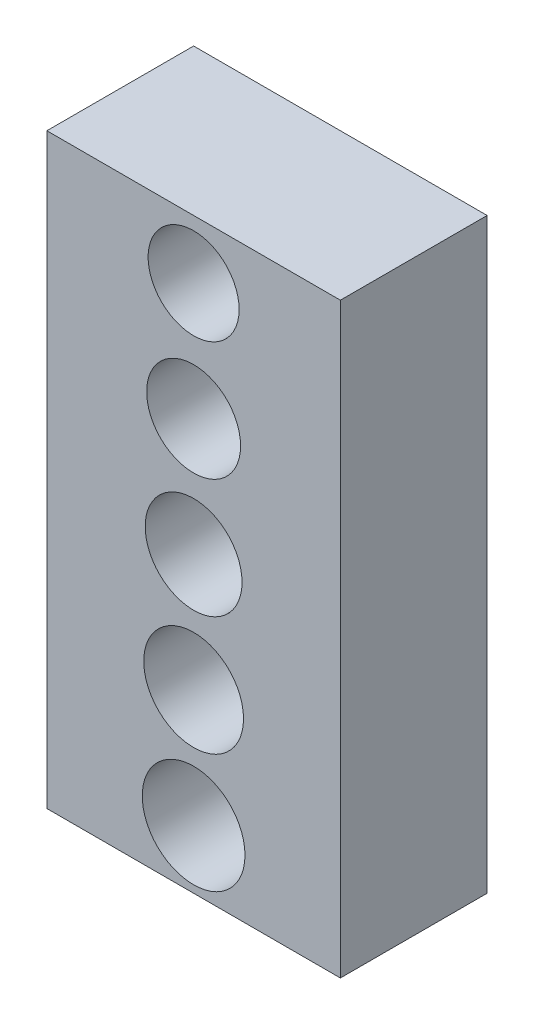
ISO-10303-21;
HEADER;
FILE_DESCRIPTION(('STEP AP214'),'2;1');
FILE_NAME('part.step','',(''),(''),'','','');
FILE_SCHEMA(('AUTOMOTIVE_DESIGN { 1 0 10303 214 1 1 1 1 }'));
ENDSEC;
DATA;
#1=APPLICATION_CONTEXT('core data for automotive mechanical design processes');
#2=APPLICATION_PROTOCOL_DEFINITION('international standard','automotive_design',2000,#1);
#3=PRODUCT_CONTEXT('',#1,'mechanical');
#4=PRODUCT('Part','Part','',(#3));
#5=PRODUCT_RELATED_PRODUCT_CATEGORY('part','',(#4));
#6=PRODUCT_DEFINITION_FORMATION('','',#4);
#7=PRODUCT_DEFINITION_CONTEXT('part definition',#1,'design');
#8=PRODUCT_DEFINITION('design','',#6,#7);
#9=PRODUCT_DEFINITION_SHAPE('','',#8);
#10=(LENGTH_UNIT() NAMED_UNIT(*) SI_UNIT(.MILLI.,.METRE.));
#11=(NAMED_UNIT(*) PLANE_ANGLE_UNIT() SI_UNIT($,.RADIAN.));
#12=(NAMED_UNIT(*) SI_UNIT($,.STERADIAN.) SOLID_ANGLE_UNIT());
#13=UNCERTAINTY_MEASURE_WITH_UNIT(LENGTH_MEASURE(1.E-05),#10,'distance_accuracy_value','');
#14=(GEOMETRIC_REPRESENTATION_CONTEXT(3) GLOBAL_UNCERTAINTY_ASSIGNED_CONTEXT((#13)) GLOBAL_UNIT_ASSIGNED_CONTEXT((#10,
#11,#12)) REPRESENTATION_CONTEXT('',''));
#15=CARTESIAN_POINT('',(0.,0.,0.));
#16=DIRECTION('',(0.,0.,1.));
#17=DIRECTION('',(1.,0.,0.));
#18=AXIS2_PLACEMENT_3D('',#15,#16,#17);
#19=CARTESIAN_POINT('',(0.,0.,5.));
#20=DIRECTION('',(0.,0.,-1.));
#21=DIRECTION('',(-1.,0.,0.));
#22=AXIS2_PLACEMENT_3D('',#19,#20,#21);
#23=PLANE('',#22);
#24=DIRECTION('',(0.,-1.,0.));
#25=VECTOR('',#24,1.);
#26=CARTESIAN_POINT('',(-5.,10.,5.));
#27=LINE('',#26,#25);
#28=CARTESIAN_POINT('',(-5.,10.,5.));
#29=VERTEX_POINT('',#28);
#30=CARTESIAN_POINT('',(-5.,-10.,5.));
#31=VERTEX_POINT('',#30);
#32=EDGE_CURVE('E85',#29,#31,#27,.T.);
#33=ORIENTED_EDGE('',*,*,#32,.T.);
#34=DIRECTION('',(1.,0.,0.));
#35=VECTOR('',#34,1.);
#36=CARTESIAN_POINT('',(5.,-10.,5.));
#37=LINE('',#36,#35);
#38=CARTESIAN_POINT('',(5.,-10.,5.));
#39=VERTEX_POINT('',#38);
#40=EDGE_CURVE('E80',#31,#39,#37,.T.);
#41=ORIENTED_EDGE('',*,*,#40,.T.);
#42=DIRECTION('',(0.,1.,0.));
#43=VECTOR('',#42,1.);
#44=CARTESIAN_POINT('',(5.,10.,5.));
#45=LINE('',#44,#43);
#46=CARTESIAN_POINT('',(5.,10.,5.));
#47=VERTEX_POINT('',#46);
#48=EDGE_CURVE('E83',#39,#47,#45,.T.);
#49=ORIENTED_EDGE('',*,*,#48,.T.);
#50=DIRECTION('',(-1.,0.,0.));
#51=VECTOR('',#50,1.);
#52=CARTESIAN_POINT('',(5.,10.,5.));
#53=LINE('',#52,#51);
#54=EDGE_CURVE('E50',#47,#29,#53,.T.);
#55=ORIENTED_EDGE('',*,*,#54,.T.);
#56=EDGE_LOOP('',(#33,#41,#49,#55));
#57=FACE_BOUND('',#56,.T.);
#58=CARTESIAN_POINT('',(0.,8.,5.));
#59=DIRECTION('',(0.,0.,1.));
#60=DIRECTION('',(1.,0.,0.));
#61=AXIS2_PLACEMENT_3D('',#58,#59,#60);
#62=CIRCLE('',#61,1.55);
#63=CARTESIAN_POINT('',(1.55,8.,5.));
#64=VERTEX_POINT('',#63);
#65=EDGE_CURVE('E100',#64,#64,#62,.T.);
#66=ORIENTED_EDGE('',*,*,#65,.F.);
#67=EDGE_LOOP('',(#66));
#68=FACE_BOUND('',#67,.T.);
#69=CARTESIAN_POINT('',(0.,-8.,5.));
#70=DIRECTION('',(0.,0.,1.));
#71=DIRECTION('',(1.,0.,0.));
#72=AXIS2_PLACEMENT_3D('',#69,#70,#71);
#73=CIRCLE('',#72,1.75);
#74=CARTESIAN_POINT('',(1.75,-8.,5.));
#75=VERTEX_POINT('',#74);
#76=EDGE_CURVE('E115',#75,#75,#73,.T.);
#77=ORIENTED_EDGE('',*,*,#76,.F.);
#78=EDGE_LOOP('',(#77));
#79=FACE_BOUND('',#78,.T.);
#80=CARTESIAN_POINT('',(0.,0.,5.));
#81=DIRECTION('',(0.,0.,1.));
#82=DIRECTION('',(1.,0.,0.));
#83=AXIS2_PLACEMENT_3D('',#80,#81,#82);
#84=CIRCLE('',#83,1.65);
#85=CARTESIAN_POINT('',(1.65,0.,5.));
#86=VERTEX_POINT('',#85);
#87=EDGE_CURVE('E121',#86,#86,#84,.T.);
#88=ORIENTED_EDGE('',*,*,#87,.F.);
#89=EDGE_LOOP('',(#88));
#90=FACE_BOUND('',#89,.T.);
#91=CARTESIAN_POINT('',(0.,-4.,5.));
#92=DIRECTION('',(0.,0.,1.));
#93=DIRECTION('',(1.,0.,0.));
#94=AXIS2_PLACEMENT_3D('',#91,#92,#93);
#95=CIRCLE('',#94,1.7);
#96=CARTESIAN_POINT('',(1.7,-4.,5.));
#97=VERTEX_POINT('',#96);
#98=EDGE_CURVE('E127',#97,#97,#95,.T.);
#99=ORIENTED_EDGE('',*,*,#98,.F.);
#100=EDGE_LOOP('',(#99));
#101=FACE_BOUND('',#100,.T.);
#102=CARTESIAN_POINT('',(0.,4.,5.));
#103=DIRECTION('',(0.,0.,1.));
#104=DIRECTION('',(1.,0.,0.));
#105=AXIS2_PLACEMENT_3D('',#102,#103,#104);
#106=CIRCLE('',#105,1.6);
#107=CARTESIAN_POINT('',(1.6,4.,5.));
#108=VERTEX_POINT('',#107);
#109=EDGE_CURVE('E133',#108,#108,#106,.T.);
#110=ORIENTED_EDGE('',*,*,#109,.F.);
#111=EDGE_LOOP('',(#110));
#112=FACE_BOUND('',#111,.T.);
#113=ADVANCED_FACE('F33',(#57,#68,#79,#90,#101,#112),#23,.F.);
#114=CARTESIAN_POINT('',(0.,0.,0.));
#115=DIRECTION('',(0.,0.,-1.));
#116=DIRECTION('',(-1.,0.,0.));
#117=AXIS2_PLACEMENT_3D('',#114,#115,#116);
#118=PLANE('',#117);
#119=CARTESIAN_POINT('',(0.,-4.,0.));
#120=DIRECTION('',(0.,0.,1.));
#121=DIRECTION('',(1.,0.,0.));
#122=AXIS2_PLACEMENT_3D('',#119,#120,#121);
#123=CIRCLE('',#122,1.7);
#124=CARTESIAN_POINT('',(1.7,-4.,0.));
#125=VERTEX_POINT('',#124);
#126=EDGE_CURVE('E130',#125,#125,#123,.T.);
#127=ORIENTED_EDGE('',*,*,#126,.T.);
#128=EDGE_LOOP('',(#127));
#129=FACE_BOUND('',#128,.T.);
#130=CARTESIAN_POINT('',(0.,-8.,0.));
#131=DIRECTION('',(0.,0.,1.));
#132=DIRECTION('',(1.,0.,0.));
#133=AXIS2_PLACEMENT_3D('',#130,#131,#132);
#134=CIRCLE('',#133,1.75);
#135=CARTESIAN_POINT('',(1.75,-8.,0.));
#136=VERTEX_POINT('',#135);
#137=EDGE_CURVE('E118',#136,#136,#134,.T.);
#138=ORIENTED_EDGE('',*,*,#137,.T.);
#139=EDGE_LOOP('',(#138));
#140=FACE_BOUND('',#139,.T.);
#141=DIRECTION('',(0.,-1.,0.));
#142=VECTOR('',#141,1.);
#143=CARTESIAN_POINT('',(-5.,10.,0.));
#144=LINE('',#143,#142);
#145=CARTESIAN_POINT('',(-5.,10.,0.));
#146=VERTEX_POINT('',#145);
#147=CARTESIAN_POINT('',(-5.,-10.,0.));
#148=VERTEX_POINT('',#147);
#149=EDGE_CURVE('E97',#146,#148,#144,.T.);
#150=ORIENTED_EDGE('',*,*,#149,.F.);
#151=DIRECTION('',(-1.,0.,0.));
#152=VECTOR('',#151,1.);
#153=CARTESIAN_POINT('',(5.,10.,0.));
#154=LINE('',#153,#152);
#155=CARTESIAN_POINT('',(5.,10.,0.));
#156=VERTEX_POINT('',#155);
#157=EDGE_CURVE('E73',#156,#146,#154,.T.);
#158=ORIENTED_EDGE('',*,*,#157,.F.);
#159=DIRECTION('',(0.,1.,0.));
#160=VECTOR('',#159,1.);
#161=CARTESIAN_POINT('',(5.,10.,0.));
#162=LINE('',#161,#160);
#163=CARTESIAN_POINT('',(5.,-10.,0.));
#164=VERTEX_POINT('',#163);
#165=EDGE_CURVE('E67',#164,#156,#162,.T.);
#166=ORIENTED_EDGE('',*,*,#165,.F.);
#167=DIRECTION('',(1.,0.,0.));
#168=VECTOR('',#167,1.);
#169=CARTESIAN_POINT('',(5.,-10.,0.));
#170=LINE('',#169,#168);
#171=EDGE_CURVE('E89',#148,#164,#170,.T.);
#172=ORIENTED_EDGE('',*,*,#171,.F.);
#173=EDGE_LOOP('',(#150,#158,#166,#172));
#174=FACE_BOUND('',#173,.T.);
#175=CARTESIAN_POINT('',(0.,8.,0.));
#176=DIRECTION('',(0.,0.,1.));
#177=DIRECTION('',(1.,0.,0.));
#178=AXIS2_PLACEMENT_3D('',#175,#176,#177);
#179=CIRCLE('',#178,1.55);
#180=CARTESIAN_POINT('',(1.55,8.,0.));
#181=VERTEX_POINT('',#180);
#182=EDGE_CURVE('E112',#181,#181,#179,.T.);
#183=ORIENTED_EDGE('',*,*,#182,.T.);
#184=EDGE_LOOP('',(#183));
#185=FACE_BOUND('',#184,.T.);
#186=CARTESIAN_POINT('',(0.,0.,0.));
#187=DIRECTION('',(0.,0.,1.));
#188=DIRECTION('',(1.,0.,0.));
#189=AXIS2_PLACEMENT_3D('',#186,#187,#188);
#190=CIRCLE('',#189,1.65);
#191=CARTESIAN_POINT('',(1.65,0.,0.));
#192=VERTEX_POINT('',#191);
#193=EDGE_CURVE('E124',#192,#192,#190,.T.);
#194=ORIENTED_EDGE('',*,*,#193,.T.);
#195=EDGE_LOOP('',(#194));
#196=FACE_BOUND('',#195,.T.);
#197=CARTESIAN_POINT('',(0.,4.,0.));
#198=DIRECTION('',(0.,0.,1.));
#199=DIRECTION('',(1.,0.,0.));
#200=AXIS2_PLACEMENT_3D('',#197,#198,#199);
#201=CIRCLE('',#200,1.6);
#202=CARTESIAN_POINT('',(1.6,4.,0.));
#203=VERTEX_POINT('',#202);
#204=EDGE_CURVE('E136',#203,#203,#201,.T.);
#205=ORIENTED_EDGE('',*,*,#204,.T.);
#206=EDGE_LOOP('',(#205));
#207=FACE_BOUND('',#206,.T.);
#208=ADVANCED_FACE('F108',(#129,#140,#174,#185,#196,#207),#118,.T.);
#209=CARTESIAN_POINT('',(-5.,10.,5.));
#210=DIRECTION('',(1.,0.,0.));
#211=DIRECTION('',(0.,1.,0.));
#212=AXIS2_PLACEMENT_3D('',#209,#210,#211);
#213=PLANE('',#212);
#214=ORIENTED_EDGE('',*,*,#149,.T.);
#215=DIRECTION('',(0.,0.,-1.));
#216=VECTOR('',#215,1.);
#217=CARTESIAN_POINT('',(-5.,-10.,5.));
#218=LINE('',#217,#216);
#219=EDGE_CURVE('E11',#31,#148,#218,.T.);
#220=ORIENTED_EDGE('',*,*,#219,.F.);
#221=ORIENTED_EDGE('',*,*,#32,.F.);
#222=DIRECTION('',(0.,0.,-1.));
#223=VECTOR('',#222,1.);
#224=CARTESIAN_POINT('',(-5.,10.,5.));
#225=LINE('',#224,#223);
#226=EDGE_CURVE('E93',#29,#146,#225,.T.);
#227=ORIENTED_EDGE('',*,*,#226,.T.);
#228=EDGE_LOOP('',(#214,#220,#221,#227));
#229=FACE_BOUND('',#228,.T.);
#230=ADVANCED_FACE('F35',(#229),#213,.F.);
#231=CARTESIAN_POINT('',(5.,-10.,5.));
#232=DIRECTION('',(0.,1.,0.));
#233=DIRECTION('',(-1.,0.,0.));
#234=AXIS2_PLACEMENT_3D('',#231,#232,#233);
#235=PLANE('',#234);
#236=ORIENTED_EDGE('',*,*,#171,.T.);
#237=DIRECTION('',(0.,0.,-1.));
#238=VECTOR('',#237,1.);
#239=CARTESIAN_POINT('',(5.,-10.,5.));
#240=LINE('',#239,#238);
#241=EDGE_CURVE('E42',#39,#164,#240,.T.);
#242=ORIENTED_EDGE('',*,*,#241,.F.);
#243=ORIENTED_EDGE('',*,*,#40,.F.);
#244=ORIENTED_EDGE('',*,*,#219,.T.);
#245=EDGE_LOOP('',(#236,#242,#243,#244));
#246=FACE_BOUND('',#245,.T.);
#247=ADVANCED_FACE('F88',(#246),#235,.F.);
#248=CARTESIAN_POINT('',(5.,10.,5.));
#249=DIRECTION('',(-1.,0.,0.));
#250=DIRECTION('',(0.,-1.,0.));
#251=AXIS2_PLACEMENT_3D('',#248,#249,#250);
#252=PLANE('',#251);
#253=ORIENTED_EDGE('',*,*,#165,.T.);
#254=DIRECTION('',(0.,0.,-1.));
#255=VECTOR('',#254,1.);
#256=CARTESIAN_POINT('',(5.,10.,5.));
#257=LINE('',#256,#255);
#258=EDGE_CURVE('E90',#47,#156,#257,.T.);
#259=ORIENTED_EDGE('',*,*,#258,.F.);
#260=ORIENTED_EDGE('',*,*,#48,.F.);
#261=ORIENTED_EDGE('',*,*,#241,.T.);
#262=EDGE_LOOP('',(#253,#259,#260,#261));
#263=FACE_BOUND('',#262,.T.);
#264=ADVANCED_FACE('F91',(#263),#252,.F.);
#265=CARTESIAN_POINT('',(5.,10.,5.));
#266=DIRECTION('',(0.,-1.,0.));
#267=DIRECTION('',(1.,0.,0.));
#268=AXIS2_PLACEMENT_3D('',#265,#266,#267);
#269=PLANE('',#268);
#270=ORIENTED_EDGE('',*,*,#157,.T.);
#271=ORIENTED_EDGE('',*,*,#226,.F.);
#272=ORIENTED_EDGE('',*,*,#54,.F.);
#273=ORIENTED_EDGE('',*,*,#258,.T.);
#274=EDGE_LOOP('',(#270,#271,#272,#273));
#275=FACE_BOUND('',#274,.T.);
#276=ADVANCED_FACE('F105',(#275),#269,.F.);
#277=CARTESIAN_POINT('',(0.,8.,5.));
#278=DIRECTION('',(0.,0.,-1.));
#279=DIRECTION('',(-1.,0.,0.));
#280=AXIS2_PLACEMENT_3D('',#277,#278,#279);
#281=CYLINDRICAL_SURFACE('',#280,1.55);
#282=ORIENTED_EDGE('',*,*,#65,.T.);
#283=EDGE_LOOP('',(#282));
#284=FACE_BOUND('',#283,.T.);
#285=ORIENTED_EDGE('',*,*,#182,.F.);
#286=EDGE_LOOP('',(#285));
#287=FACE_BOUND('',#286,.T.);
#288=ADVANCED_FACE('F153',(#284,#287),#281,.F.);
#289=CARTESIAN_POINT('',(0.,-8.,5.));
#290=DIRECTION('',(0.,0.,-1.));
#291=DIRECTION('',(-1.,0.,0.));
#292=AXIS2_PLACEMENT_3D('',#289,#290,#291);
#293=CYLINDRICAL_SURFACE('',#292,1.75);
#294=ORIENTED_EDGE('',*,*,#76,.T.);
#295=EDGE_LOOP('',(#294));
#296=FACE_BOUND('',#295,.T.);
#297=ORIENTED_EDGE('',*,*,#137,.F.);
#298=EDGE_LOOP('',(#297));
#299=FACE_BOUND('',#298,.T.);
#300=ADVANCED_FACE('F199',(#296,#299),#293,.F.);
#301=CARTESIAN_POINT('',(0.,0.,5.));
#302=DIRECTION('',(0.,0.,-1.));
#303=DIRECTION('',(-1.,0.,0.));
#304=AXIS2_PLACEMENT_3D('',#301,#302,#303);
#305=CYLINDRICAL_SURFACE('',#304,1.65);
#306=ORIENTED_EDGE('',*,*,#87,.T.);
#307=EDGE_LOOP('',(#306));
#308=FACE_BOUND('',#307,.T.);
#309=ORIENTED_EDGE('',*,*,#193,.F.);
#310=EDGE_LOOP('',(#309));
#311=FACE_BOUND('',#310,.T.);
#312=ADVANCED_FACE('F207',(#308,#311),#305,.F.);
#313=CARTESIAN_POINT('',(0.,-4.,5.));
#314=DIRECTION('',(0.,0.,-1.));
#315=DIRECTION('',(-1.,0.,0.));
#316=AXIS2_PLACEMENT_3D('',#313,#314,#315);
#317=CYLINDRICAL_SURFACE('',#316,1.7);
#318=ORIENTED_EDGE('',*,*,#98,.T.);
#319=EDGE_LOOP('',(#318));
#320=FACE_BOUND('',#319,.T.);
#321=ORIENTED_EDGE('',*,*,#126,.F.);
#322=EDGE_LOOP('',(#321));
#323=FACE_BOUND('',#322,.T.);
#324=ADVANCED_FACE('F215',(#320,#323),#317,.F.);
#325=CARTESIAN_POINT('',(0.,4.,5.));
#326=DIRECTION('',(0.,0.,-1.));
#327=DIRECTION('',(-1.,0.,0.));
#328=AXIS2_PLACEMENT_3D('',#325,#326,#327);
#329=CYLINDRICAL_SURFACE('',#328,1.6);
#330=ORIENTED_EDGE('',*,*,#109,.T.);
#331=EDGE_LOOP('',(#330));
#332=FACE_BOUND('',#331,.T.);
#333=ORIENTED_EDGE('',*,*,#204,.F.);
#334=EDGE_LOOP('',(#333));
#335=FACE_BOUND('',#334,.T.);
#336=ADVANCED_FACE('F142',(#332,#335),#329,.F.);
#337=CLOSED_SHELL('',(#113,#208,#230,#247,#264,#276,#288,#300,#312,#324,#336));
#338=MANIFOLD_SOLID_BREP('B2',#337);
#339=ADVANCED_BREP_SHAPE_REPRESENTATION('',(#18,#338),#14);
#340=SHAPE_DEFINITION_REPRESENTATION(#9,#339);
ENDSEC;
END-ISO-10303-21;
